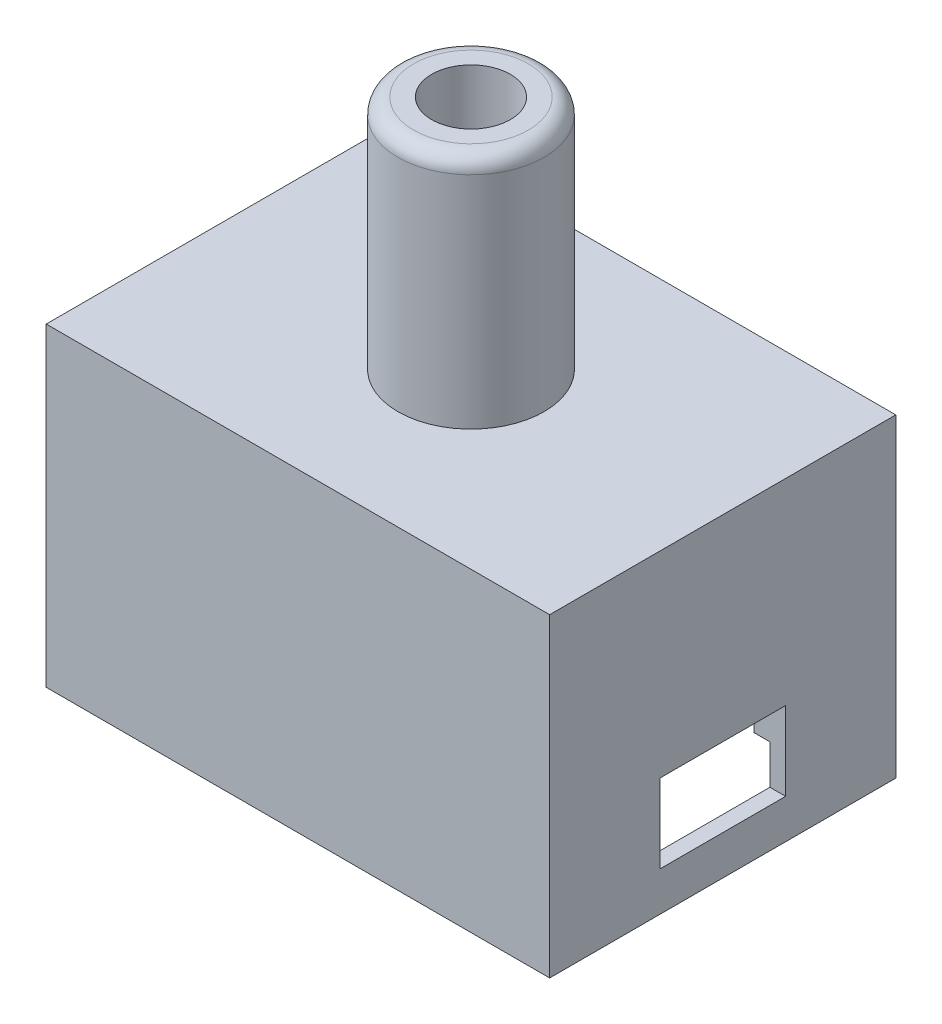
ISO-10303-21;
HEADER;
FILE_DESCRIPTION(('STEP AP214'),'2;1');
FILE_NAME('part.step','',(''),(''),'','','');
FILE_SCHEMA(('AUTOMOTIVE_DESIGN { 1 0 10303 214 1 1 1 1 }'));
ENDSEC;
DATA;
#1=APPLICATION_CONTEXT('core data for automotive mechanical design processes');
#2=APPLICATION_PROTOCOL_DEFINITION('international standard','automotive_design',2000,#1);
#3=PRODUCT_CONTEXT('',#1,'mechanical');
#4=PRODUCT('Part','Part','',(#3));
#5=PRODUCT_RELATED_PRODUCT_CATEGORY('part','',(#4));
#6=PRODUCT_DEFINITION_FORMATION('','',#4);
#7=PRODUCT_DEFINITION_CONTEXT('part definition',#1,'design');
#8=PRODUCT_DEFINITION('design','',#6,#7);
#9=PRODUCT_DEFINITION_SHAPE('','',#8);
#10=(LENGTH_UNIT() NAMED_UNIT(*) SI_UNIT(.MILLI.,.METRE.));
#11=(NAMED_UNIT(*) PLANE_ANGLE_UNIT() SI_UNIT($,.RADIAN.));
#12=(NAMED_UNIT(*) SI_UNIT($,.STERADIAN.) SOLID_ANGLE_UNIT());
#13=UNCERTAINTY_MEASURE_WITH_UNIT(LENGTH_MEASURE(1.E-05),#10,'distance_accuracy_value','');
#14=(GEOMETRIC_REPRESENTATION_CONTEXT(3) GLOBAL_UNCERTAINTY_ASSIGNED_CONTEXT((#13)) GLOBAL_UNIT_ASSIGNED_CONTEXT((#10,
#11,#12)) REPRESENTATION_CONTEXT('',''));
#15=CARTESIAN_POINT('',(0.,0.,0.));
#16=DIRECTION('',(0.,0.,1.));
#17=DIRECTION('',(1.,0.,0.));
#18=AXIS2_PLACEMENT_3D('',#15,#16,#17);
#19=CARTESIAN_POINT('',(16.,20.,11.));
#20=DIRECTION('',(-1.,0.,0.));
#21=DIRECTION('',(0.,0.,1.));
#22=AXIS2_PLACEMENT_3D('',#19,#20,#21);
#23=PLANE('',#22);
#24=DIRECTION('',(0.,1.,0.));
#25=VECTOR('',#24,1.);
#26=CARTESIAN_POINT('',(16.,2.5,-4.));
#27=LINE('',#26,#25);
#28=CARTESIAN_POINT('',(16.,2.5,-4.));
#29=VERTEX_POINT('',#28);
#30=CARTESIAN_POINT('',(16.,7.5,-4.));
#31=VERTEX_POINT('',#30);
#32=EDGE_CURVE('E184',#29,#31,#27,.T.);
#33=ORIENTED_EDGE('',*,*,#32,.F.);
#34=DIRECTION('',(0.,0.,-1.));
#35=VECTOR('',#34,1.);
#36=CARTESIAN_POINT('',(16.,2.5,-4.));
#37=LINE('',#36,#35);
#38=CARTESIAN_POINT('',(16.,2.5,4.));
#39=VERTEX_POINT('',#38);
#40=EDGE_CURVE('E190',#39,#29,#37,.T.);
#41=ORIENTED_EDGE('',*,*,#40,.F.);
#42=DIRECTION('',(0.,-1.,0.));
#43=VECTOR('',#42,1.);
#44=CARTESIAN_POINT('',(16.,2.5,4.));
#45=LINE('',#44,#43);
#46=CARTESIAN_POINT('',(16.,7.49999999999999,4.));
#47=VERTEX_POINT('',#46);
#48=EDGE_CURVE('E195',#47,#39,#45,.T.);
#49=ORIENTED_EDGE('',*,*,#48,.F.);
#50=DIRECTION('',(0.,0.,1.));
#51=VECTOR('',#50,1.);
#52=CARTESIAN_POINT('',(16.,7.5,-4.));
#53=LINE('',#52,#51);
#54=EDGE_CURVE('E65',#31,#47,#53,.T.);
#55=ORIENTED_EDGE('',*,*,#54,.F.);
#56=EDGE_LOOP('',(#33,#41,#49,#55));
#57=FACE_BOUND('',#56,.T.);
#58=DIRECTION('',(0.,0.,-1.));
#59=VECTOR('',#58,1.);
#60=CARTESIAN_POINT('',(16.,0.,11.));
#61=LINE('',#60,#59);
#62=CARTESIAN_POINT('',(16.,0.,11.));
#63=VERTEX_POINT('',#62);
#64=CARTESIAN_POINT('',(16.,0.,-11.));
#65=VERTEX_POINT('',#64);
#66=EDGE_CURVE('E275',#63,#65,#61,.T.);
#67=ORIENTED_EDGE('',*,*,#66,.T.);
#68=DIRECTION('',(0.,-1.,0.));
#69=VECTOR('',#68,1.);
#70=CARTESIAN_POINT('',(16.,20.,-11.));
#71=LINE('',#70,#69);
#72=CARTESIAN_POINT('',(16.,20.,-11.));
#73=VERTEX_POINT('',#72);
#74=EDGE_CURVE('E285',#73,#65,#71,.T.);
#75=ORIENTED_EDGE('',*,*,#74,.F.);
#76=DIRECTION('',(0.,0.,-1.));
#77=VECTOR('',#76,1.);
#78=CARTESIAN_POINT('',(16.,20.,11.));
#79=LINE('',#78,#77);
#80=CARTESIAN_POINT('',(16.,20.,11.));
#81=VERTEX_POINT('',#80);
#82=EDGE_CURVE('E286',#81,#73,#79,.T.);
#83=ORIENTED_EDGE('',*,*,#82,.F.);
#84=DIRECTION('',(0.,-1.,0.));
#85=VECTOR('',#84,1.);
#86=CARTESIAN_POINT('',(16.,20.,11.));
#87=LINE('',#86,#85);
#88=EDGE_CURVE('E296',#81,#63,#87,.T.);
#89=ORIENTED_EDGE('',*,*,#88,.T.);
#90=EDGE_LOOP('',(#67,#75,#83,#89));
#91=FACE_BOUND('',#90,.T.);
#92=ADVANCED_FACE('F50',(#57,#91),#23,.F.);
#93=CARTESIAN_POINT('',(-16.,20.,-11.));
#94=DIRECTION('',(0.,0.,1.));
#95=DIRECTION('',(1.,0.,0.));
#96=AXIS2_PLACEMENT_3D('',#93,#94,#95);
#97=PLANE('',#96);
#98=DIRECTION('',(-1.,0.,0.));
#99=VECTOR('',#98,1.);
#100=CARTESIAN_POINT('',(-16.,0.,-11.));
#101=LINE('',#100,#99);
#102=CARTESIAN_POINT('',(-16.,0.,-11.));
#103=VERTEX_POINT('',#102);
#104=EDGE_CURVE('E299',#65,#103,#101,.T.);
#105=ORIENTED_EDGE('',*,*,#104,.T.);
#106=DIRECTION('',(0.,-1.,0.));
#107=VECTOR('',#106,1.);
#108=CARTESIAN_POINT('',(-16.,20.,-11.));
#109=LINE('',#108,#107);
#110=CARTESIAN_POINT('',(-16.,20.,-11.));
#111=VERTEX_POINT('',#110);
#112=EDGE_CURVE('E309',#111,#103,#109,.T.);
#113=ORIENTED_EDGE('',*,*,#112,.F.);
#114=DIRECTION('',(-1.,0.,0.));
#115=VECTOR('',#114,1.);
#116=CARTESIAN_POINT('',(-16.,20.,-11.));
#117=LINE('',#116,#115);
#118=EDGE_CURVE('E289',#73,#111,#117,.T.);
#119=ORIENTED_EDGE('',*,*,#118,.F.);
#120=ORIENTED_EDGE('',*,*,#74,.T.);
#121=EDGE_LOOP('',(#105,#113,#119,#120));
#122=FACE_BOUND('',#121,.T.);
#123=ADVANCED_FACE('F382',(#122),#97,.F.);
#124=CARTESIAN_POINT('',(-16.,20.,11.));
#125=DIRECTION('',(1.,0.,0.));
#126=DIRECTION('',(0.,0.,-1.));
#127=AXIS2_PLACEMENT_3D('',#124,#125,#126);
#128=PLANE('',#127);
#129=DIRECTION('',(0.,0.,1.));
#130=VECTOR('',#129,1.);
#131=CARTESIAN_POINT('',(-16.,0.,11.));
#132=LINE('',#131,#130);
#133=CARTESIAN_POINT('',(-16.,0.,11.));
#134=VERTEX_POINT('',#133);
#135=EDGE_CURVE('E301',#103,#134,#132,.T.);
#136=ORIENTED_EDGE('',*,*,#135,.T.);
#137=DIRECTION('',(0.,-1.,0.));
#138=VECTOR('',#137,1.);
#139=CARTESIAN_POINT('',(-16.,20.,11.));
#140=LINE('',#139,#138);
#141=CARTESIAN_POINT('',(-16.,20.,11.));
#142=VERTEX_POINT('',#141);
#143=EDGE_CURVE('E306',#142,#134,#140,.T.);
#144=ORIENTED_EDGE('',*,*,#143,.F.);
#145=DIRECTION('',(0.,0.,1.));
#146=VECTOR('',#145,1.);
#147=CARTESIAN_POINT('',(-16.,20.,11.));
#148=LINE('',#147,#146);
#149=EDGE_CURVE('E292',#111,#142,#148,.T.);
#150=ORIENTED_EDGE('',*,*,#149,.F.);
#151=ORIENTED_EDGE('',*,*,#112,.T.);
#152=EDGE_LOOP('',(#136,#144,#150,#151));
#153=FACE_BOUND('',#152,.T.);
#154=ADVANCED_FACE('F387',(#153),#128,.F.);
#155=CARTESIAN_POINT('',(-16.,20.,11.));
#156=DIRECTION('',(0.,0.,-1.));
#157=DIRECTION('',(-1.,0.,0.));
#158=AXIS2_PLACEMENT_3D('',#155,#156,#157);
#159=PLANE('',#158);
#160=DIRECTION('',(1.,0.,0.));
#161=VECTOR('',#160,1.);
#162=CARTESIAN_POINT('',(-16.,0.,11.));
#163=LINE('',#162,#161);
#164=EDGE_CURVE('E290',#134,#63,#163,.T.);
#165=ORIENTED_EDGE('',*,*,#164,.T.);
#166=ORIENTED_EDGE('',*,*,#88,.F.);
#167=DIRECTION('',(1.,0.,0.));
#168=VECTOR('',#167,1.);
#169=CARTESIAN_POINT('',(-16.,20.,11.));
#170=LINE('',#169,#168);
#171=EDGE_CURVE('E294',#142,#81,#170,.T.);
#172=ORIENTED_EDGE('',*,*,#171,.F.);
#173=ORIENTED_EDGE('',*,*,#143,.T.);
#174=EDGE_LOOP('',(#165,#166,#172,#173));
#175=FACE_BOUND('',#174,.T.);
#176=ADVANCED_FACE('F427',(#175),#159,.F.);
#177=CARTESIAN_POINT('',(0.,20.,0.));
#178=DIRECTION('',(0.,-1.,0.));
#179=DIRECTION('',(0.,0.,-1.));
#180=AXIS2_PLACEMENT_3D('',#177,#178,#179);
#181=PLANE('',#180);
#182=CARTESIAN_POINT('',(0.,20.,0.));
#183=DIRECTION('',(0.,1.,0.));
#184=DIRECTION('',(0.,0.,1.));
#185=AXIS2_PLACEMENT_3D('',#182,#183,#184);
#186=CIRCLE('',#185,4.65);
#187=CARTESIAN_POINT('',(0.,20.,4.65));
#188=VERTEX_POINT('',#187);
#189=EDGE_CURVE('E281',#188,#188,#186,.T.);
#190=ORIENTED_EDGE('',*,*,#189,.F.);
#191=EDGE_LOOP('',(#190));
#192=FACE_BOUND('',#191,.T.);
#193=ORIENTED_EDGE('',*,*,#82,.T.);
#194=ORIENTED_EDGE('',*,*,#118,.T.);
#195=ORIENTED_EDGE('',*,*,#149,.T.);
#196=ORIENTED_EDGE('',*,*,#171,.T.);
#197=EDGE_LOOP('',(#193,#194,#195,#196));
#198=FACE_BOUND('',#197,.T.);
#199=ADVANCED_FACE('F424',(#192,#198),#181,.F.);
#200=CARTESIAN_POINT('',(0.,0.,0.));
#201=DIRECTION('',(0.,-1.,0.));
#202=DIRECTION('',(0.,0.,-1.));
#203=AXIS2_PLACEMENT_3D('',#200,#201,#202);
#204=PLANE('',#203);
#205=DIRECTION('',(0.,0.,-1.));
#206=VECTOR('',#205,1.);
#207=CARTESIAN_POINT('',(-15.,0.,-10.));
#208=LINE('',#207,#206);
#209=CARTESIAN_POINT('',(-15.,0.,10.));
#210=VERTEX_POINT('',#209);
#211=CARTESIAN_POINT('',(-15.,0.,-10.));
#212=VERTEX_POINT('',#211);
#213=EDGE_CURVE('E260',#210,#212,#208,.T.);
#214=ORIENTED_EDGE('',*,*,#213,.F.);
#215=DIRECTION('',(-1.,0.,0.));
#216=VECTOR('',#215,1.);
#217=CARTESIAN_POINT('',(15.,0.,10.));
#218=LINE('',#217,#216);
#219=CARTESIAN_POINT('',(15.,0.,10.));
#220=VERTEX_POINT('',#219);
#221=EDGE_CURVE('E269',#220,#210,#218,.T.);
#222=ORIENTED_EDGE('',*,*,#221,.F.);
#223=DIRECTION('',(0.,0.,1.));
#224=VECTOR('',#223,1.);
#225=CARTESIAN_POINT('',(15.,0.,-10.));
#226=LINE('',#225,#224);
#227=CARTESIAN_POINT('',(15.,0.,-10.));
#228=VERTEX_POINT('',#227);
#229=EDGE_CURVE('E266',#228,#220,#226,.T.);
#230=ORIENTED_EDGE('',*,*,#229,.F.);
#231=DIRECTION('',(1.,0.,0.));
#232=VECTOR('',#231,1.);
#233=CARTESIAN_POINT('',(15.,0.,-10.));
#234=LINE('',#233,#232);
#235=EDGE_CURVE('E263',#212,#228,#234,.T.);
#236=ORIENTED_EDGE('',*,*,#235,.F.);
#237=EDGE_LOOP('',(#214,#222,#230,#236));
#238=FACE_BOUND('',#237,.T.);
#239=ORIENTED_EDGE('',*,*,#66,.F.);
#240=ORIENTED_EDGE('',*,*,#164,.F.);
#241=ORIENTED_EDGE('',*,*,#135,.F.);
#242=ORIENTED_EDGE('',*,*,#104,.F.);
#243=EDGE_LOOP('',(#239,#240,#241,#242));
#244=FACE_BOUND('',#243,.T.);
#245=ADVANCED_FACE('F419',(#238,#244),#204,.T.);
#246=CARTESIAN_POINT('',(0.,35.,0.));
#247=DIRECTION('',(0.,-1.,0.));
#248=DIRECTION('',(0.,0.,-1.));
#249=AXIS2_PLACEMENT_3D('',#246,#247,#248);
#250=CYLINDRICAL_SURFACE('',#249,4.65);
#251=CARTESIAN_POINT('',(0.,34.,0.));
#252=DIRECTION('',(0.,1.,0.));
#253=DIRECTION('',(0.,0.,1.));
#254=AXIS2_PLACEMENT_3D('',#251,#252,#253);
#255=CIRCLE('',#254,4.65);
#256=CARTESIAN_POINT('',(0.,34.,4.65));
#257=VERTEX_POINT('',#256);
#258=EDGE_CURVE('E316',#257,#257,#255,.F.);
#259=ORIENTED_EDGE('',*,*,#258,.T.);
#260=EDGE_LOOP('',(#259));
#261=FACE_BOUND('',#260,.T.);
#262=ORIENTED_EDGE('',*,*,#189,.T.);
#263=EDGE_LOOP('',(#262));
#264=FACE_BOUND('',#263,.T.);
#265=ADVANCED_FACE('F410',(#261,#264),#250,.T.);
#266=CARTESIAN_POINT('',(0.,35.,0.));
#267=DIRECTION('',(0.,1.,0.));
#268=DIRECTION('',(0.,0.,1.));
#269=AXIS2_PLACEMENT_3D('',#266,#267,#268);
#270=PLANE('',#269);
#271=CARTESIAN_POINT('',(0.,35.,0.));
#272=DIRECTION('',(0.,1.,0.));
#273=DIRECTION('',(0.,0.,1.));
#274=AXIS2_PLACEMENT_3D('',#271,#272,#273);
#275=CIRCLE('',#274,3.65);
#276=CARTESIAN_POINT('',(0.,35.,3.65));
#277=VERTEX_POINT('',#276);
#278=EDGE_CURVE('E284',#277,#277,#275,.T.);
#279=ORIENTED_EDGE('',*,*,#278,.T.);
#280=EDGE_LOOP('',(#279));
#281=FACE_BOUND('',#280,.T.);
#282=CARTESIAN_POINT('',(0.,35.,0.));
#283=DIRECTION('',(0.,-1.,0.));
#284=DIRECTION('',(0.,0.,-1.));
#285=AXIS2_PLACEMENT_3D('',#282,#283,#284);
#286=CIRCLE('',#285,2.5);
#287=CARTESIAN_POINT('',(0.,35.,-2.5));
#288=VERTEX_POINT('',#287);
#289=EDGE_CURVE('E257',#288,#288,#286,.T.);
#290=ORIENTED_EDGE('',*,*,#289,.T.);
#291=EDGE_LOOP('',(#290));
#292=FACE_BOUND('',#291,.T.);
#293=ADVANCED_FACE('F407',(#281,#292),#270,.T.);
#294=CARTESIAN_POINT('',(-15.,56.0555127546399,-10.));
#295=DIRECTION('',(-1.,0.,0.));
#296=DIRECTION('',(0.,0.,1.));
#297=AXIS2_PLACEMENT_3D('',#294,#295,#296);
#298=PLANE('',#297);
#299=DIRECTION('',(0.,-1.,0.));
#300=VECTOR('',#299,1.);
#301=CARTESIAN_POINT('',(-15.,56.0555127546399,-10.));
#302=LINE('',#301,#300);
#303=CARTESIAN_POINT('',(-15.,5.,-10.));
#304=VERTEX_POINT('',#303);
#305=EDGE_CURVE('E272',#304,#212,#302,.T.);
#306=ORIENTED_EDGE('',*,*,#305,.F.);
#307=DIRECTION('',(0.,0.,-1.));
#308=VECTOR('',#307,1.);
#309=CARTESIAN_POINT('',(-15.,5.,-10.));
#310=LINE('',#309,#308);
#311=CARTESIAN_POINT('',(-15.,5.,10.));
#312=VERTEX_POINT('',#311);
#313=EDGE_CURVE('E247',#312,#304,#310,.T.);
#314=ORIENTED_EDGE('',*,*,#313,.F.);
#315=DIRECTION('',(0.,-1.,0.));
#316=VECTOR('',#315,1.);
#317=CARTESIAN_POINT('',(-15.,56.0555127546399,10.));
#318=LINE('',#317,#316);
#319=EDGE_CURVE('E273',#312,#210,#318,.T.);
#320=ORIENTED_EDGE('',*,*,#319,.T.);
#321=ORIENTED_EDGE('',*,*,#213,.T.);
#322=EDGE_LOOP('',(#306,#314,#320,#321));
#323=FACE_BOUND('',#322,.T.);
#324=ADVANCED_FACE('F364',(#323),#298,.F.);
#325=CARTESIAN_POINT('',(15.,56.0555127546399,10.));
#326=DIRECTION('',(0.,0.,1.));
#327=DIRECTION('',(1.,0.,0.));
#328=AXIS2_PLACEMENT_3D('',#325,#326,#327);
#329=PLANE('',#328);
#330=ORIENTED_EDGE('',*,*,#319,.F.);
#331=DIRECTION('',(-1.,0.,0.));
#332=VECTOR('',#331,1.);
#333=CARTESIAN_POINT('',(15.,5.,10.));
#334=LINE('',#333,#332);
#335=CARTESIAN_POINT('',(15.,5.,10.));
#336=VERTEX_POINT('',#335);
#337=EDGE_CURVE('E255',#336,#312,#334,.T.);
#338=ORIENTED_EDGE('',*,*,#337,.F.);
#339=DIRECTION('',(0.,-1.,0.));
#340=VECTOR('',#339,1.);
#341=CARTESIAN_POINT('',(15.,56.0555127546399,10.));
#342=LINE('',#341,#340);
#343=EDGE_CURVE('E276',#336,#220,#342,.T.);
#344=ORIENTED_EDGE('',*,*,#343,.T.);
#345=ORIENTED_EDGE('',*,*,#221,.T.);
#346=EDGE_LOOP('',(#330,#338,#344,#345));
#347=FACE_BOUND('',#346,.T.);
#348=ADVANCED_FACE('F358',(#347),#329,.F.);
#349=CARTESIAN_POINT('',(15.,56.0555127546399,-10.));
#350=DIRECTION('',(1.,0.,0.));
#351=DIRECTION('',(0.,0.,-1.));
#352=AXIS2_PLACEMENT_3D('',#349,#350,#351);
#353=PLANE('',#352);
#354=DIRECTION('',(0.,0.,-1.));
#355=VECTOR('',#354,1.);
#356=CARTESIAN_POINT('',(15.,2.5,-10.));
#357=LINE('',#356,#355);
#358=CARTESIAN_POINT('',(15.,2.5,4.));
#359=VERTEX_POINT('',#358);
#360=CARTESIAN_POINT('',(15.,2.5,-4.));
#361=VERTEX_POINT('',#360);
#362=EDGE_CURVE('E14',#359,#361,#357,.T.);
#363=ORIENTED_EDGE('',*,*,#362,.T.);
#364=DIRECTION('',(0.,1.,0.));
#365=VECTOR('',#364,1.);
#366=CARTESIAN_POINT('',(15.,56.0555127546399,-4.));
#367=LINE('',#366,#365);
#368=CARTESIAN_POINT('',(15.,5.,-4.));
#369=VERTEX_POINT('',#368);
#370=EDGE_CURVE('E214',#361,#369,#367,.T.);
#371=ORIENTED_EDGE('',*,*,#370,.T.);
#372=DIRECTION('',(0.,0.,1.));
#373=VECTOR('',#372,1.);
#374=CARTESIAN_POINT('',(15.,5.,-10.));
#375=LINE('',#374,#373);
#376=CARTESIAN_POINT('',(15.,5.,-10.));
#377=VERTEX_POINT('',#376);
#378=EDGE_CURVE('E252',#377,#369,#375,.T.);
#379=ORIENTED_EDGE('',*,*,#378,.F.);
#380=DIRECTION('',(0.,-1.,0.));
#381=VECTOR('',#380,1.);
#382=CARTESIAN_POINT('',(15.,56.0555127546399,-10.));
#383=LINE('',#382,#381);
#384=EDGE_CURVE('E278',#377,#228,#383,.T.);
#385=ORIENTED_EDGE('',*,*,#384,.T.);
#386=ORIENTED_EDGE('',*,*,#229,.T.);
#387=ORIENTED_EDGE('',*,*,#343,.F.);
#388=CARTESIAN_POINT('',(15.,5.,4.));
#389=VERTEX_POINT('',#388);
#390=EDGE_CURVE('E251',#389,#336,#375,.T.);
#391=ORIENTED_EDGE('',*,*,#390,.F.);
#392=DIRECTION('',(0.,-1.,0.));
#393=VECTOR('',#392,1.);
#394=CARTESIAN_POINT('',(15.,56.0555127546399,4.));
#395=LINE('',#394,#393);
#396=EDGE_CURVE('E209',#389,#359,#395,.T.);
#397=ORIENTED_EDGE('',*,*,#396,.T.);
#398=EDGE_LOOP('',(#363,#371,#379,#385,#386,#387,#391,#397));
#399=FACE_BOUND('',#398,.T.);
#400=ADVANCED_FACE('F353',(#399),#353,.F.);
#401=CARTESIAN_POINT('',(15.,56.0555127546399,-10.));
#402=DIRECTION('',(0.,0.,-1.));
#403=DIRECTION('',(-1.,0.,0.));
#404=AXIS2_PLACEMENT_3D('',#401,#402,#403);
#405=PLANE('',#404);
#406=ORIENTED_EDGE('',*,*,#384,.F.);
#407=DIRECTION('',(1.,0.,0.));
#408=VECTOR('',#407,1.);
#409=CARTESIAN_POINT('',(15.,5.,-10.));
#410=LINE('',#409,#408);
#411=EDGE_CURVE('E249',#304,#377,#410,.T.);
#412=ORIENTED_EDGE('',*,*,#411,.F.);
#413=ORIENTED_EDGE('',*,*,#305,.T.);
#414=ORIENTED_EDGE('',*,*,#235,.T.);
#415=EDGE_LOOP('',(#406,#412,#413,#414));
#416=FACE_BOUND('',#415,.T.);
#417=ADVANCED_FACE('F368',(#416),#405,.F.);
#418=CARTESIAN_POINT('',(0.,19.,0.));
#419=DIRECTION('',(0.,-1.,0.));
#420=DIRECTION('',(0.,0.,-1.));
#421=AXIS2_PLACEMENT_3D('',#418,#419,#420);
#422=PLANE('',#421);
#423=DIRECTION('',(0.,0.,-1.));
#424=VECTOR('',#423,1.);
#425=CARTESIAN_POINT('',(-14.,19.,-9.));
#426=LINE('',#425,#424);
#427=CARTESIAN_POINT('',(-14.,19.,9.));
#428=VERTEX_POINT('',#427);
#429=CARTESIAN_POINT('',(-14.,19.,-9.));
#430=VERTEX_POINT('',#429);
#431=EDGE_CURVE('E217',#428,#430,#426,.T.);
#432=ORIENTED_EDGE('',*,*,#431,.T.);
#433=DIRECTION('',(1.,0.,0.));
#434=VECTOR('',#433,1.);
#435=CARTESIAN_POINT('',(14.,19.,-9.));
#436=LINE('',#435,#434);
#437=CARTESIAN_POINT('',(14.,19.,-9.));
#438=VERTEX_POINT('',#437);
#439=EDGE_CURVE('E231',#430,#438,#436,.T.);
#440=ORIENTED_EDGE('',*,*,#439,.T.);
#441=DIRECTION('',(0.,0.,1.));
#442=VECTOR('',#441,1.);
#443=CARTESIAN_POINT('',(14.,19.,-9.));
#444=LINE('',#443,#442);
#445=CARTESIAN_POINT('',(14.,19.,9.));
#446=VERTEX_POINT('',#445);
#447=EDGE_CURVE('E233',#438,#446,#444,.T.);
#448=ORIENTED_EDGE('',*,*,#447,.T.);
#449=DIRECTION('',(-1.,0.,0.));
#450=VECTOR('',#449,1.);
#451=CARTESIAN_POINT('',(14.,19.,9.));
#452=LINE('',#451,#450);
#453=EDGE_CURVE('E221',#446,#428,#452,.T.);
#454=ORIENTED_EDGE('',*,*,#453,.T.);
#455=EDGE_LOOP('',(#432,#440,#448,#454));
#456=FACE_BOUND('',#455,.T.);
#457=CARTESIAN_POINT('',(0.,19.,0.));
#458=DIRECTION('',(0.,-1.,0.));
#459=DIRECTION('',(0.,0.,-1.));
#460=AXIS2_PLACEMENT_3D('',#457,#458,#459);
#461=CIRCLE('',#460,3.5);
#462=CARTESIAN_POINT('',(0.,19.,-3.5));
#463=VERTEX_POINT('',#462);
#464=EDGE_CURVE('E322',#463,#463,#461,.F.);
#465=ORIENTED_EDGE('',*,*,#464,.T.);
#466=EDGE_LOOP('',(#465));
#467=FACE_BOUND('',#466,.T.);
#468=ADVANCED_FACE('F400',(#456,#467),#422,.T.);
#469=CARTESIAN_POINT('',(0.,35.,0.));
#470=DIRECTION('',(0.,-1.,0.));
#471=DIRECTION('',(0.,0.,-1.));
#472=AXIS2_PLACEMENT_3D('',#469,#470,#471);
#473=CYLINDRICAL_SURFACE('',#472,2.5);
#474=CARTESIAN_POINT('',(0.,20.,0.));
#475=DIRECTION('',(0.,-1.,0.));
#476=DIRECTION('',(0.,0.,-1.));
#477=AXIS2_PLACEMENT_3D('',#474,#475,#476);
#478=CIRCLE('',#477,2.5);
#479=CARTESIAN_POINT('',(0.,20.,-2.5));
#480=VERTEX_POINT('',#479);
#481=EDGE_CURVE('E319',#480,#480,#478,.T.);
#482=ORIENTED_EDGE('',*,*,#481,.T.);
#483=EDGE_LOOP('',(#482));
#484=FACE_BOUND('',#483,.T.);
#485=ORIENTED_EDGE('',*,*,#289,.F.);
#486=EDGE_LOOP('',(#485));
#487=FACE_BOUND('',#486,.T.);
#488=ADVANCED_FACE('F393',(#484,#487),#473,.F.);
#489=CARTESIAN_POINT('',(0.,34.,0.));
#490=DIRECTION('',(0.,1.,0.));
#491=DIRECTION('',(0.,0.,1.));
#492=AXIS2_PLACEMENT_3D('',#489,#490,#491);
#493=TOROIDAL_SURFACE('',#492,3.65,1.);
#494=ORIENTED_EDGE('',*,*,#258,.F.);
#495=EDGE_LOOP('',(#494));
#496=FACE_BOUND('',#495,.T.);
#497=ORIENTED_EDGE('',*,*,#278,.F.);
#498=EDGE_LOOP('',(#497));
#499=FACE_BOUND('',#498,.T.);
#500=ADVANCED_FACE('F391',(#496,#499),#493,.T.);
#501=CARTESIAN_POINT('',(0.,20.,0.));
#502=DIRECTION('',(0.,-1.,0.));
#503=DIRECTION('',(0.,0.,-1.));
#504=AXIS2_PLACEMENT_3D('',#501,#502,#503);
#505=TOROIDAL_SURFACE('',#504,3.5,1.);
#506=ORIENTED_EDGE('',*,*,#464,.F.);
#507=EDGE_LOOP('',(#506));
#508=FACE_BOUND('',#507,.T.);
#509=ORIENTED_EDGE('',*,*,#481,.F.);
#510=EDGE_LOOP('',(#509));
#511=FACE_BOUND('',#510,.T.);
#512=ADVANCED_FACE('F52',(#508,#511),#505,.T.);
#513=CARTESIAN_POINT('',(0.,5.,0.));
#514=DIRECTION('',(0.,-1.,0.));
#515=DIRECTION('',(0.,0.,-1.));
#516=AXIS2_PLACEMENT_3D('',#513,#514,#515);
#517=PLANE('',#516);
#518=DIRECTION('',(1.,0.,0.));
#519=VECTOR('',#518,1.);
#520=CARTESIAN_POINT('',(0.,5.,-4.));
#521=LINE('',#520,#519);
#522=CARTESIAN_POINT('',(14.,5.,-4.));
#523=VERTEX_POINT('',#522);
#524=EDGE_CURVE('E212',#523,#369,#521,.T.);
#525=ORIENTED_EDGE('',*,*,#524,.F.);
#526=DIRECTION('',(0.,0.,1.));
#527=VECTOR('',#526,1.);
#528=CARTESIAN_POINT('',(14.,5.,-9.));
#529=LINE('',#528,#527);
#530=CARTESIAN_POINT('',(14.,5.,-9.));
#531=VERTEX_POINT('',#530);
#532=EDGE_CURVE('E224',#531,#523,#529,.T.);
#533=ORIENTED_EDGE('',*,*,#532,.F.);
#534=DIRECTION('',(1.,0.,0.));
#535=VECTOR('',#534,1.);
#536=CARTESIAN_POINT('',(14.,5.,-9.));
#537=LINE('',#536,#535);
#538=CARTESIAN_POINT('',(-14.,5.,-9.));
#539=VERTEX_POINT('',#538);
#540=EDGE_CURVE('E220',#539,#531,#537,.T.);
#541=ORIENTED_EDGE('',*,*,#540,.F.);
#542=DIRECTION('',(0.,0.,-1.));
#543=VECTOR('',#542,1.);
#544=CARTESIAN_POINT('',(-14.,5.,-9.));
#545=LINE('',#544,#543);
#546=CARTESIAN_POINT('',(-14.,5.,9.));
#547=VERTEX_POINT('',#546);
#548=EDGE_CURVE('E218',#547,#539,#545,.T.);
#549=ORIENTED_EDGE('',*,*,#548,.F.);
#550=DIRECTION('',(-1.,0.,0.));
#551=VECTOR('',#550,1.);
#552=CARTESIAN_POINT('',(14.,5.,9.));
#553=LINE('',#552,#551);
#554=CARTESIAN_POINT('',(14.,5.,9.));
#555=VERTEX_POINT('',#554);
#556=EDGE_CURVE('E227',#555,#547,#553,.T.);
#557=ORIENTED_EDGE('',*,*,#556,.F.);
#558=CARTESIAN_POINT('',(14.,5.,4.));
#559=VERTEX_POINT('',#558);
#560=EDGE_CURVE('E223',#559,#555,#529,.T.);
#561=ORIENTED_EDGE('',*,*,#560,.F.);
#562=DIRECTION('',(-1.,0.,0.));
#563=VECTOR('',#562,1.);
#564=CARTESIAN_POINT('',(0.,5.,4.));
#565=LINE('',#564,#563);
#566=EDGE_CURVE('E73',#389,#559,#565,.T.);
#567=ORIENTED_EDGE('',*,*,#566,.F.);
#568=ORIENTED_EDGE('',*,*,#390,.T.);
#569=ORIENTED_EDGE('',*,*,#337,.T.);
#570=ORIENTED_EDGE('',*,*,#313,.T.);
#571=ORIENTED_EDGE('',*,*,#411,.T.);
#572=ORIENTED_EDGE('',*,*,#378,.T.);
#573=EDGE_LOOP('',(#525,#533,#541,#549,#557,#561,#567,#568,#569,#570,#571,#572));
#574=FACE_BOUND('',#573,.T.);
#575=ADVANCED_FACE('F328',(#574),#517,.T.);
#576=CARTESIAN_POINT('',(-14.,5.,-9.));
#577=DIRECTION('',(1.,0.,0.));
#578=DIRECTION('',(0.,0.,-1.));
#579=AXIS2_PLACEMENT_3D('',#576,#577,#578);
#580=PLANE('',#579);
#581=ORIENTED_EDGE('',*,*,#431,.F.);
#582=DIRECTION('',(0.,1.,0.));
#583=VECTOR('',#582,1.);
#584=CARTESIAN_POINT('',(-14.,5.,9.));
#585=LINE('',#584,#583);
#586=EDGE_CURVE('E229',#547,#428,#585,.T.);
#587=ORIENTED_EDGE('',*,*,#586,.F.);
#588=ORIENTED_EDGE('',*,*,#548,.T.);
#589=DIRECTION('',(0.,1.,0.));
#590=VECTOR('',#589,1.);
#591=CARTESIAN_POINT('',(-14.,5.,-9.));
#592=LINE('',#591,#590);
#593=EDGE_CURVE('E244',#539,#430,#592,.T.);
#594=ORIENTED_EDGE('',*,*,#593,.T.);
#595=EDGE_LOOP('',(#581,#587,#588,#594));
#596=FACE_BOUND('',#595,.T.);
#597=ADVANCED_FACE('F344',(#596),#580,.T.);
#598=CARTESIAN_POINT('',(14.,5.,-9.));
#599=DIRECTION('',(0.,0.,1.));
#600=DIRECTION('',(1.,0.,0.));
#601=AXIS2_PLACEMENT_3D('',#598,#599,#600);
#602=PLANE('',#601);
#603=ORIENTED_EDGE('',*,*,#439,.F.);
#604=ORIENTED_EDGE('',*,*,#593,.F.);
#605=ORIENTED_EDGE('',*,*,#540,.T.);
#606=DIRECTION('',(0.,1.,0.));
#607=VECTOR('',#606,1.);
#608=CARTESIAN_POINT('',(14.,5.,-9.));
#609=LINE('',#608,#607);
#610=EDGE_CURVE('E241',#531,#438,#609,.T.);
#611=ORIENTED_EDGE('',*,*,#610,.T.);
#612=EDGE_LOOP('',(#603,#604,#605,#611));
#613=FACE_BOUND('',#612,.T.);
#614=ADVANCED_FACE('F336',(#613),#602,.T.);
#615=CARTESIAN_POINT('',(14.,5.,-9.));
#616=DIRECTION('',(-1.,0.,0.));
#617=DIRECTION('',(0.,0.,1.));
#618=AXIS2_PLACEMENT_3D('',#615,#616,#617);
#619=PLANE('',#618);
#620=DIRECTION('',(0.,-1.,0.));
#621=VECTOR('',#620,1.);
#622=CARTESIAN_POINT('',(14.,5.,-4.));
#623=LINE('',#622,#621);
#624=CARTESIAN_POINT('',(14.,7.5,-4.));
#625=VERTEX_POINT('',#624);
#626=EDGE_CURVE('E58',#625,#523,#623,.T.);
#627=ORIENTED_EDGE('',*,*,#626,.F.);
#628=DIRECTION('',(0.,0.,1.));
#629=VECTOR('',#628,1.);
#630=CARTESIAN_POINT('',(14.,7.5,-4.));
#631=LINE('',#630,#629);
#632=CARTESIAN_POINT('',(14.,7.5,4.));
#633=VERTEX_POINT('',#632);
#634=EDGE_CURVE('E178',#625,#633,#631,.T.);
#635=ORIENTED_EDGE('',*,*,#634,.T.);
#636=DIRECTION('',(0.,-1.,0.));
#637=VECTOR('',#636,1.);
#638=CARTESIAN_POINT('',(14.,2.5,4.));
#639=LINE('',#638,#637);
#640=EDGE_CURVE('E201',#633,#559,#639,.T.);
#641=ORIENTED_EDGE('',*,*,#640,.T.);
#642=ORIENTED_EDGE('',*,*,#560,.T.);
#643=DIRECTION('',(0.,1.,0.));
#644=VECTOR('',#643,1.);
#645=CARTESIAN_POINT('',(14.,5.,9.));
#646=LINE('',#645,#644);
#647=EDGE_CURVE('E238',#555,#446,#646,.T.);
#648=ORIENTED_EDGE('',*,*,#647,.T.);
#649=ORIENTED_EDGE('',*,*,#447,.F.);
#650=ORIENTED_EDGE('',*,*,#610,.F.);
#651=ORIENTED_EDGE('',*,*,#532,.T.);
#652=EDGE_LOOP('',(#627,#635,#641,#642,#648,#649,#650,#651));
#653=FACE_BOUND('',#652,.T.);
#654=ADVANCED_FACE('F332',(#653),#619,.T.);
#655=CARTESIAN_POINT('',(14.,5.,9.));
#656=DIRECTION('',(0.,0.,-1.));
#657=DIRECTION('',(-1.,0.,0.));
#658=AXIS2_PLACEMENT_3D('',#655,#656,#657);
#659=PLANE('',#658);
#660=ORIENTED_EDGE('',*,*,#453,.F.);
#661=ORIENTED_EDGE('',*,*,#647,.F.);
#662=ORIENTED_EDGE('',*,*,#556,.T.);
#663=ORIENTED_EDGE('',*,*,#586,.T.);
#664=EDGE_LOOP('',(#660,#661,#662,#663));
#665=FACE_BOUND('',#664,.T.);
#666=ADVANCED_FACE('F347',(#665),#659,.T.);
#667=CARTESIAN_POINT('',(4.56601886794339,2.5,-4.));
#668=DIRECTION('',(0.,-1.,0.));
#669=DIRECTION('',(0.,0.,-1.));
#670=AXIS2_PLACEMENT_3D('',#667,#668,#669);
#671=PLANE('',#670);
#672=DIRECTION('',(1.,0.,0.));
#673=VECTOR('',#672,1.);
#674=CARTESIAN_POINT('',(4.56601886794339,2.5,4.));
#675=LINE('',#674,#673);
#676=EDGE_CURVE('E203',#359,#39,#675,.T.);
#677=ORIENTED_EDGE('',*,*,#676,.T.);
#678=ORIENTED_EDGE('',*,*,#40,.T.);
#679=DIRECTION('',(1.,0.,0.));
#680=VECTOR('',#679,1.);
#681=CARTESIAN_POINT('',(4.56601886794339,2.5,-4.));
#682=LINE('',#681,#680);
#683=EDGE_CURVE('E181',#361,#29,#682,.T.);
#684=ORIENTED_EDGE('',*,*,#683,.F.);
#685=ORIENTED_EDGE('',*,*,#362,.F.);
#686=EDGE_LOOP('',(#677,#678,#684,#685));
#687=FACE_BOUND('',#686,.T.);
#688=ADVANCED_FACE('F370',(#687),#671,.F.);
#689=CARTESIAN_POINT('',(4.56601886794339,2.5,-4.));
#690=DIRECTION('',(0.,0.,-1.));
#691=DIRECTION('',(-1.,0.,0.));
#692=AXIS2_PLACEMENT_3D('',#689,#690,#691);
#693=PLANE('',#692);
#694=ORIENTED_EDGE('',*,*,#683,.T.);
#695=ORIENTED_EDGE('',*,*,#32,.T.);
#696=DIRECTION('',(1.,0.,0.));
#697=VECTOR('',#696,1.);
#698=CARTESIAN_POINT('',(4.56601886794339,7.5,-4.));
#699=LINE('',#698,#697);
#700=EDGE_CURVE('E174',#625,#31,#699,.T.);
#701=ORIENTED_EDGE('',*,*,#700,.F.);
#702=ORIENTED_EDGE('',*,*,#626,.T.);
#703=ORIENTED_EDGE('',*,*,#524,.T.);
#704=ORIENTED_EDGE('',*,*,#370,.F.);
#705=EDGE_LOOP('',(#694,#695,#701,#702,#703,#704));
#706=FACE_BOUND('',#705,.T.);
#707=ADVANCED_FACE('F185',(#706),#693,.F.);
#708=CARTESIAN_POINT('',(4.56601886794339,2.5,4.));
#709=DIRECTION('',(0.,0.,1.));
#710=DIRECTION('',(1.,0.,0.));
#711=AXIS2_PLACEMENT_3D('',#708,#709,#710);
#712=PLANE('',#711);
#713=ORIENTED_EDGE('',*,*,#566,.T.);
#714=ORIENTED_EDGE('',*,*,#640,.F.);
#715=DIRECTION('',(1.,0.,0.));
#716=VECTOR('',#715,1.);
#717=CARTESIAN_POINT('',(4.56601886794339,7.5,4.));
#718=LINE('',#717,#716);
#719=EDGE_CURVE('E204',#633,#47,#718,.T.);
#720=ORIENTED_EDGE('',*,*,#719,.T.);
#721=ORIENTED_EDGE('',*,*,#48,.T.);
#722=ORIENTED_EDGE('',*,*,#676,.F.);
#723=ORIENTED_EDGE('',*,*,#396,.F.);
#724=EDGE_LOOP('',(#713,#714,#720,#721,#722,#723));
#725=FACE_BOUND('',#724,.T.);
#726=ADVANCED_FACE('F372',(#725),#712,.F.);
#727=CARTESIAN_POINT('',(4.56601886794339,7.5,-4.));
#728=DIRECTION('',(0.,1.,0.));
#729=DIRECTION('',(0.,0.,1.));
#730=AXIS2_PLACEMENT_3D('',#727,#728,#729);
#731=PLANE('',#730);
#732=ORIENTED_EDGE('',*,*,#700,.T.);
#733=ORIENTED_EDGE('',*,*,#54,.T.);
#734=ORIENTED_EDGE('',*,*,#719,.F.);
#735=ORIENTED_EDGE('',*,*,#634,.F.);
#736=EDGE_LOOP('',(#732,#733,#734,#735));
#737=FACE_BOUND('',#736,.T.);
#738=ADVANCED_FACE('F176',(#737),#731,.F.);
#739=CLOSED_SHELL('',(#92,#123,#154,#176,#199,#245,#265,#293,#324,#348,#400,#417,#468,#488,#500,
#512,#575,#597,#614,#654,#666,#688,#707,#726,#738));
#740=MANIFOLD_SOLID_BREP('B2',#739);
#741=ADVANCED_BREP_SHAPE_REPRESENTATION('',(#18,#740),#14);
#742=SHAPE_DEFINITION_REPRESENTATION(#9,#741);
ENDSEC;
END-ISO-10303-21;
